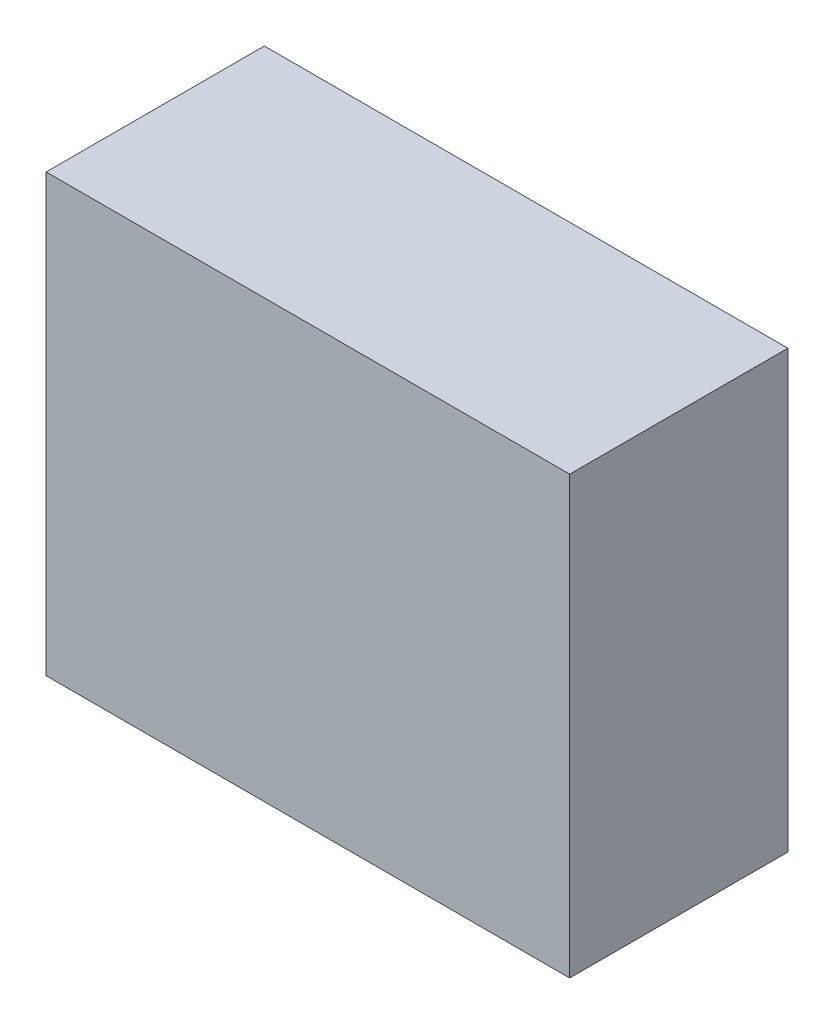
ISO-10303-21;
HEADER;
FILE_DESCRIPTION(('STEP AP214'),'2;1');
FILE_NAME('part.step','',(''),(''),'','','');
FILE_SCHEMA(('AUTOMOTIVE_DESIGN { 1 0 10303 214 1 1 1 1 }'));
ENDSEC;
DATA;
#1=APPLICATION_CONTEXT('core data for automotive mechanical design processes');
#2=APPLICATION_PROTOCOL_DEFINITION('international standard','automotive_design',2000,#1);
#3=PRODUCT_CONTEXT('',#1,'mechanical');
#4=PRODUCT('Part','Part','',(#3));
#5=PRODUCT_RELATED_PRODUCT_CATEGORY('part','',(#4));
#6=PRODUCT_DEFINITION_FORMATION('','',#4);
#7=PRODUCT_DEFINITION_CONTEXT('part definition',#1,'design');
#8=PRODUCT_DEFINITION('design','',#6,#7);
#9=PRODUCT_DEFINITION_SHAPE('','',#8);
#10=(LENGTH_UNIT() NAMED_UNIT(*) SI_UNIT(.MILLI.,.METRE.));
#11=(NAMED_UNIT(*) PLANE_ANGLE_UNIT() SI_UNIT($,.RADIAN.));
#12=(NAMED_UNIT(*) SI_UNIT($,.STERADIAN.) SOLID_ANGLE_UNIT());
#13=UNCERTAINTY_MEASURE_WITH_UNIT(LENGTH_MEASURE(1.E-05),#10,'distance_accuracy_value','');
#14=(GEOMETRIC_REPRESENTATION_CONTEXT(3) GLOBAL_UNCERTAINTY_ASSIGNED_CONTEXT((#13)) GLOBAL_UNIT_ASSIGNED_CONTEXT((#10,
#11,#12)) REPRESENTATION_CONTEXT('',''));
#15=CARTESIAN_POINT('',(0.,0.,0.));
#16=DIRECTION('',(0.,0.,1.));
#17=DIRECTION('',(1.,0.,0.));
#18=AXIS2_PLACEMENT_3D('',#15,#16,#17);
#19=CARTESIAN_POINT('',(-0.30478984,-0.2540127,0.254));
#20=DIRECTION('',(0.,0.,1.));
#21=DIRECTION('',(1.,0.,0.));
#22=AXIS2_PLACEMENT_3D('',#19,#20,#21);
#23=PLANE('',#22);
#24=DIRECTION('',(-1.,0.,0.));
#25=VECTOR('',#24,1.);
#26=CARTESIAN_POINT('',(0.30479238,-0.2540127,0.254));
#27=LINE('',#26,#25);
#28=CARTESIAN_POINT('',(0.30479238,-0.2540127,0.254));
#29=VERTEX_POINT('',#28);
#30=CARTESIAN_POINT('',(-0.30478984,-0.2540127,0.254));
#31=VERTEX_POINT('',#30);
#32=EDGE_CURVE('E20',#29,#31,#27,.T.);
#33=ORIENTED_EDGE('',*,*,#32,.F.);
#34=DIRECTION('',(0.,-1.,0.));
#35=VECTOR('',#34,1.);
#36=CARTESIAN_POINT('',(0.30479238,0.25401524,0.254));
#37=LINE('',#36,#35);
#38=CARTESIAN_POINT('',(0.30479238,0.25401524,0.254));
#39=VERTEX_POINT('',#38);
#40=EDGE_CURVE('E99',#39,#29,#37,.T.);
#41=ORIENTED_EDGE('',*,*,#40,.F.);
#42=DIRECTION('',(0.999999994999208,0.000100007916791721,0.));
#43=VECTOR('',#42,1.);
#44=CARTESIAN_POINT('',(-0.30475936,0.25395428,0.254));
#45=LINE('',#44,#43);
#46=CARTESIAN_POINT('',(-0.30475936,0.25395428,0.254));
#47=VERTEX_POINT('',#46);
#48=EDGE_CURVE('E84',#47,#39,#45,.T.);
#49=ORIENTED_EDGE('',*,*,#48,.F.);
#50=DIRECTION('',(6.0003900130496E-05,0.999999998199766,0.));
#51=VECTOR('',#50,1.);
#52=CARTESIAN_POINT('',(-0.30478984,-0.2540127,0.254));
#53=LINE('',#52,#51);
#54=EDGE_CURVE('E88',#31,#47,#53,.T.);
#55=ORIENTED_EDGE('',*,*,#54,.F.);
#56=EDGE_LOOP('',(#33,#41,#49,#55));
#57=FACE_BOUND('',#56,.T.);
#58=ADVANCED_FACE('F17',(#57),#23,.T.);
#59=CARTESIAN_POINT('',(-0.30478984,-0.2540127,0.));
#60=DIRECTION('',(0.,0.,1.));
#61=DIRECTION('',(1.,0.,0.));
#62=AXIS2_PLACEMENT_3D('',#59,#60,#61);
#63=PLANE('',#62);
#64=DIRECTION('',(6.0003900130496E-05,0.999999998199766,0.));
#65=VECTOR('',#64,1.);
#66=CARTESIAN_POINT('',(-0.30478984,-0.2540127,0.));
#67=LINE('',#66,#65);
#68=CARTESIAN_POINT('',(-0.30478984,-0.2540127,0.));
#69=VERTEX_POINT('',#68);
#70=CARTESIAN_POINT('',(-0.30475936,0.25395428,0.));
#71=VERTEX_POINT('',#70);
#72=EDGE_CURVE('E72',#69,#71,#67,.T.);
#73=ORIENTED_EDGE('',*,*,#72,.T.);
#74=DIRECTION('',(0.999999994999208,0.000100007916791721,0.));
#75=VECTOR('',#74,1.);
#76=CARTESIAN_POINT('',(-0.30475936,0.25395428,0.));
#77=LINE('',#76,#75);
#78=CARTESIAN_POINT('',(0.30479238,0.25401524,0.));
#79=VERTEX_POINT('',#78);
#80=EDGE_CURVE('E104',#71,#79,#77,.T.);
#81=ORIENTED_EDGE('',*,*,#80,.T.);
#82=DIRECTION('',(0.,-1.,0.));
#83=VECTOR('',#82,1.);
#84=CARTESIAN_POINT('',(0.30479238,0.25401524,0.));
#85=LINE('',#84,#83);
#86=CARTESIAN_POINT('',(0.30479238,-0.2540127,0.));
#87=VERTEX_POINT('',#86);
#88=EDGE_CURVE('E74',#79,#87,#85,.T.);
#89=ORIENTED_EDGE('',*,*,#88,.T.);
#90=DIRECTION('',(-1.,0.,0.));
#91=VECTOR('',#90,1.);
#92=CARTESIAN_POINT('',(0.30479238,-0.2540127,0.));
#93=LINE('',#92,#91);
#94=EDGE_CURVE('E11',#87,#69,#93,.T.);
#95=ORIENTED_EDGE('',*,*,#94,.T.);
#96=EDGE_LOOP('',(#73,#81,#89,#95));
#97=FACE_BOUND('',#96,.T.);
#98=ADVANCED_FACE('F70',(#97),#63,.F.);
#99=CARTESIAN_POINT('',(0.30479238,-0.2540127,0.));
#100=DIRECTION('',(0.,-1.,0.));
#101=DIRECTION('',(0.,0.,-1.));
#102=AXIS2_PLACEMENT_3D('',#99,#100,#101);
#103=PLANE('',#102);
#104=DIRECTION('',(0.,0.,1.));
#105=VECTOR('',#104,1.);
#106=CARTESIAN_POINT('',(0.30479238,-0.2540127,0.));
#107=LINE('',#106,#105);
#108=EDGE_CURVE('E103',#87,#29,#107,.T.);
#109=ORIENTED_EDGE('',*,*,#108,.T.);
#110=ORIENTED_EDGE('',*,*,#32,.T.);
#111=DIRECTION('',(0.,0.,1.));
#112=VECTOR('',#111,1.);
#113=CARTESIAN_POINT('',(-0.30478984,-0.2540127,0.));
#114=LINE('',#113,#112);
#115=EDGE_CURVE('E80',#69,#31,#114,.T.);
#116=ORIENTED_EDGE('',*,*,#115,.F.);
#117=ORIENTED_EDGE('',*,*,#94,.F.);
#118=EDGE_LOOP('',(#109,#110,#116,#117));
#119=FACE_BOUND('',#118,.T.);
#120=ADVANCED_FACE('F86',(#119),#103,.T.);
#121=CARTESIAN_POINT('',(0.30479238,0.25401524,0.));
#122=DIRECTION('',(1.,0.,0.));
#123=DIRECTION('',(0.,1.,0.));
#124=AXIS2_PLACEMENT_3D('',#121,#122,#123);
#125=PLANE('',#124);
#126=DIRECTION('',(0.,0.,1.));
#127=VECTOR('',#126,1.);
#128=CARTESIAN_POINT('',(0.30479238,0.25401524,0.));
#129=LINE('',#128,#127);
#130=EDGE_CURVE('E108',#79,#39,#129,.T.);
#131=ORIENTED_EDGE('',*,*,#130,.T.);
#132=ORIENTED_EDGE('',*,*,#40,.T.);
#133=ORIENTED_EDGE('',*,*,#108,.F.);
#134=ORIENTED_EDGE('',*,*,#88,.F.);
#135=EDGE_LOOP('',(#131,#132,#133,#134));
#136=FACE_BOUND('',#135,.T.);
#137=ADVANCED_FACE('F145',(#136),#125,.T.);
#138=CARTESIAN_POINT('',(-0.30475936,0.25395428,0.));
#139=DIRECTION('',(-0.000100007916791721,0.999999994999208,0.));
#140=DIRECTION('',(0.,0.,1.));
#141=AXIS2_PLACEMENT_3D('',#138,#139,#140);
#142=PLANE('',#141);
#143=DIRECTION('',(0.,0.,1.));
#144=VECTOR('',#143,1.);
#145=CARTESIAN_POINT('',(-0.30475936,0.25395428,0.));
#146=LINE('',#145,#144);
#147=EDGE_CURVE('E82',#71,#47,#146,.T.);
#148=ORIENTED_EDGE('',*,*,#147,.T.);
#149=ORIENTED_EDGE('',*,*,#48,.T.);
#150=ORIENTED_EDGE('',*,*,#130,.F.);
#151=ORIENTED_EDGE('',*,*,#80,.F.);
#152=EDGE_LOOP('',(#148,#149,#150,#151));
#153=FACE_BOUND('',#152,.T.);
#154=ADVANCED_FACE('F134',(#153),#142,.T.);
#155=CARTESIAN_POINT('',(-0.30478984,-0.2540127,0.));
#156=DIRECTION('',(-0.999999998199766,6.0003900130496E-05,0.));
#157=DIRECTION('',(0.,0.,1.));
#158=AXIS2_PLACEMENT_3D('',#155,#156,#157);
#159=PLANE('',#158);
#160=ORIENTED_EDGE('',*,*,#115,.T.);
#161=ORIENTED_EDGE('',*,*,#54,.T.);
#162=ORIENTED_EDGE('',*,*,#147,.F.);
#163=ORIENTED_EDGE('',*,*,#72,.F.);
#164=EDGE_LOOP('',(#160,#161,#162,#163));
#165=FACE_BOUND('',#164,.T.);
#166=ADVANCED_FACE('F78',(#165),#159,.T.);
#167=CLOSED_SHELL('',(#58,#98,#120,#137,#154,#166));
#168=MANIFOLD_SOLID_BREP('B1',#167);
#169=ADVANCED_BREP_SHAPE_REPRESENTATION('',(#18,#168),#14);
#170=SHAPE_DEFINITION_REPRESENTATION(#9,#169);
ENDSEC;
END-ISO-10303-21;
